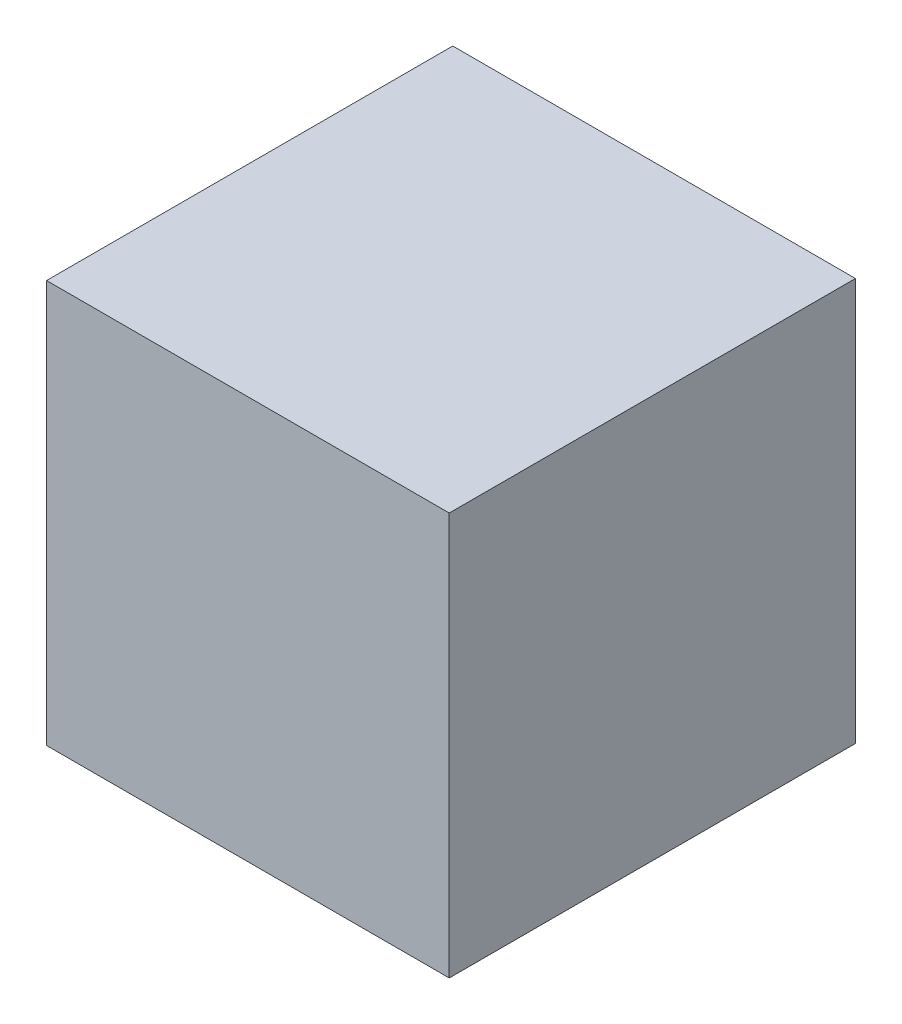
ISO-10303-21;
HEADER;
FILE_DESCRIPTION(('STEP AP214'),'2;1');
FILE_NAME('part.step','',(''),(''),'','','');
FILE_SCHEMA(('AUTOMOTIVE_DESIGN { 1 0 10303 214 1 1 1 1 }'));
ENDSEC;
DATA;
#1=APPLICATION_CONTEXT('core data for automotive mechanical design processes');
#2=APPLICATION_PROTOCOL_DEFINITION('international standard','automotive_design',2000,#1);
#3=PRODUCT_CONTEXT('',#1,'mechanical');
#4=PRODUCT('Part','Part','',(#3));
#5=PRODUCT_RELATED_PRODUCT_CATEGORY('part','',(#4));
#6=PRODUCT_DEFINITION_FORMATION('','',#4);
#7=PRODUCT_DEFINITION_CONTEXT('part definition',#1,'design');
#8=PRODUCT_DEFINITION('design','',#6,#7);
#9=PRODUCT_DEFINITION_SHAPE('','',#8);
#10=(LENGTH_UNIT() NAMED_UNIT(*) SI_UNIT(.MILLI.,.METRE.));
#11=(NAMED_UNIT(*) PLANE_ANGLE_UNIT() SI_UNIT($,.RADIAN.));
#12=(NAMED_UNIT(*) SI_UNIT($,.STERADIAN.) SOLID_ANGLE_UNIT());
#13=UNCERTAINTY_MEASURE_WITH_UNIT(LENGTH_MEASURE(1.E-05),#10,'distance_accuracy_value','');
#14=(GEOMETRIC_REPRESENTATION_CONTEXT(3) GLOBAL_UNCERTAINTY_ASSIGNED_CONTEXT((#13)) GLOBAL_UNIT_ASSIGNED_CONTEXT((#10,
#11,#12)) REPRESENTATION_CONTEXT('',''));
#15=CARTESIAN_POINT('',(0.,0.,0.));
#16=DIRECTION('',(0.,0.,1.));
#17=DIRECTION('',(1.,0.,0.));
#18=AXIS2_PLACEMENT_3D('',#15,#16,#17);
#19=CARTESIAN_POINT('',(0.,0.,20.1745240643728));
#20=DIRECTION('',(1.,0.,0.));
#21=DIRECTION('',(0.,0.,-1.));
#22=AXIS2_PLACEMENT_3D('',#19,#20,#21);
#23=PLANE('',#22);
#24=DIRECTION('',(0.,-1.,0.));
#25=VECTOR('',#24,1.);
#26=CARTESIAN_POINT('',(0.,0.,0.));
#27=LINE('',#26,#25);
#28=CARTESIAN_POINT('',(0.,20.,0.));
#29=VERTEX_POINT('',#28);
#30=CARTESIAN_POINT('',(0.,0.,0.));
#31=VERTEX_POINT('',#30);
#32=EDGE_CURVE('E98',#29,#31,#27,.T.);
#33=ORIENTED_EDGE('',*,*,#32,.T.);
#34=DIRECTION('',(0.,0.,-1.));
#35=VECTOR('',#34,1.);
#36=CARTESIAN_POINT('',(0.,0.,20.1745240643728));
#37=LINE('',#36,#35);
#38=CARTESIAN_POINT('',(0.,0.,20.1745240643728));
#39=VERTEX_POINT('',#38);
#40=EDGE_CURVE('E11',#39,#31,#37,.T.);
#41=ORIENTED_EDGE('',*,*,#40,.F.);
#42=DIRECTION('',(0.,-1.,0.));
#43=VECTOR('',#42,1.);
#44=CARTESIAN_POINT('',(0.,0.,20.1745240643728));
#45=LINE('',#44,#43);
#46=CARTESIAN_POINT('',(0.,20.,20.1745240643728));
#47=VERTEX_POINT('',#46);
#48=EDGE_CURVE('E86',#47,#39,#45,.T.);
#49=ORIENTED_EDGE('',*,*,#48,.F.);
#50=DIRECTION('',(0.,0.,-1.));
#51=VECTOR('',#50,1.);
#52=CARTESIAN_POINT('',(0.,20.,20.1745240643728));
#53=LINE('',#52,#51);
#54=EDGE_CURVE('E94',#47,#29,#53,.T.);
#55=ORIENTED_EDGE('',*,*,#54,.T.);
#56=EDGE_LOOP('',(#33,#41,#49,#55));
#57=FACE_BOUND('',#56,.T.);
#58=ADVANCED_FACE('F35',(#57),#23,.F.);
#59=CARTESIAN_POINT('',(0.,0.,20.1745240643728));
#60=DIRECTION('',(0.,1.,0.));
#61=DIRECTION('',(0.,0.,1.));
#62=AXIS2_PLACEMENT_3D('',#59,#60,#61);
#63=PLANE('',#62);
#64=DIRECTION('',(1.,0.,0.));
#65=VECTOR('',#64,1.);
#66=CARTESIAN_POINT('',(0.,0.,0.));
#67=LINE('',#66,#65);
#68=CARTESIAN_POINT('',(20.,0.,0.));
#69=VERTEX_POINT('',#68);
#70=EDGE_CURVE('E90',#31,#69,#67,.T.);
#71=ORIENTED_EDGE('',*,*,#70,.T.);
#72=DIRECTION('',(0.,0.,-1.));
#73=VECTOR('',#72,1.);
#74=CARTESIAN_POINT('',(20.,0.,20.1745240643728));
#75=LINE('',#74,#73);
#76=CARTESIAN_POINT('',(20.,0.,20.1745240643728));
#77=VERTEX_POINT('',#76);
#78=EDGE_CURVE('E43',#77,#69,#75,.T.);
#79=ORIENTED_EDGE('',*,*,#78,.F.);
#80=DIRECTION('',(1.,0.,0.));
#81=VECTOR('',#80,1.);
#82=CARTESIAN_POINT('',(0.,0.,20.1745240643728));
#83=LINE('',#82,#81);
#84=EDGE_CURVE('E81',#39,#77,#83,.T.);
#85=ORIENTED_EDGE('',*,*,#84,.F.);
#86=ORIENTED_EDGE('',*,*,#40,.T.);
#87=EDGE_LOOP('',(#71,#79,#85,#86));
#88=FACE_BOUND('',#87,.T.);
#89=ADVANCED_FACE('F89',(#88),#63,.F.);
#90=CARTESIAN_POINT('',(20.,0.,20.1745240643728));
#91=DIRECTION('',(-1.,0.,0.));
#92=DIRECTION('',(0.,0.,1.));
#93=AXIS2_PLACEMENT_3D('',#90,#91,#92);
#94=PLANE('',#93);
#95=DIRECTION('',(0.,1.,0.));
#96=VECTOR('',#95,1.);
#97=CARTESIAN_POINT('',(20.,0.,0.));
#98=LINE('',#97,#96);
#99=CARTESIAN_POINT('',(20.,20.,0.));
#100=VERTEX_POINT('',#99);
#101=EDGE_CURVE('E68',#69,#100,#98,.T.);
#102=ORIENTED_EDGE('',*,*,#101,.T.);
#103=DIRECTION('',(0.,0.,-1.));
#104=VECTOR('',#103,1.);
#105=CARTESIAN_POINT('',(20.,20.,20.1745240643728));
#106=LINE('',#105,#104);
#107=CARTESIAN_POINT('',(20.,20.,20.1745240643728));
#108=VERTEX_POINT('',#107);
#109=EDGE_CURVE('E91',#108,#100,#106,.T.);
#110=ORIENTED_EDGE('',*,*,#109,.F.);
#111=DIRECTION('',(0.,1.,0.));
#112=VECTOR('',#111,1.);
#113=CARTESIAN_POINT('',(20.,0.,20.1745240643728));
#114=LINE('',#113,#112);
#115=EDGE_CURVE('E84',#77,#108,#114,.T.);
#116=ORIENTED_EDGE('',*,*,#115,.F.);
#117=ORIENTED_EDGE('',*,*,#78,.T.);
#118=EDGE_LOOP('',(#102,#110,#116,#117));
#119=FACE_BOUND('',#118,.T.);
#120=ADVANCED_FACE('F92',(#119),#94,.F.);
#121=CARTESIAN_POINT('',(0.,20.,20.1745240643728));
#122=DIRECTION('',(0.,-1.,0.));
#123=DIRECTION('',(0.,0.,-1.));
#124=AXIS2_PLACEMENT_3D('',#121,#122,#123);
#125=PLANE('',#124);
#126=DIRECTION('',(-1.,0.,0.));
#127=VECTOR('',#126,1.);
#128=CARTESIAN_POINT('',(0.,20.,0.));
#129=LINE('',#128,#127);
#130=EDGE_CURVE('E74',#100,#29,#129,.T.);
#131=ORIENTED_EDGE('',*,*,#130,.T.);
#132=ORIENTED_EDGE('',*,*,#54,.F.);
#133=DIRECTION('',(-1.,0.,0.));
#134=VECTOR('',#133,1.);
#135=CARTESIAN_POINT('',(0.,20.,20.1745240643728));
#136=LINE('',#135,#134);
#137=EDGE_CURVE('E51',#108,#47,#136,.T.);
#138=ORIENTED_EDGE('',*,*,#137,.F.);
#139=ORIENTED_EDGE('',*,*,#109,.T.);
#140=EDGE_LOOP('',(#131,#132,#138,#139));
#141=FACE_BOUND('',#140,.T.);
#142=ADVANCED_FACE('F105',(#141),#125,.F.);
#143=CARTESIAN_POINT('',(0.,0.,20.1745240643728));
#144=DIRECTION('',(0.,0.,-1.));
#145=DIRECTION('',(-1.,0.,0.));
#146=AXIS2_PLACEMENT_3D('',#143,#144,#145);
#147=PLANE('',#146);
#148=ORIENTED_EDGE('',*,*,#48,.T.);
#149=ORIENTED_EDGE('',*,*,#84,.T.);
#150=ORIENTED_EDGE('',*,*,#115,.T.);
#151=ORIENTED_EDGE('',*,*,#137,.T.);
#152=EDGE_LOOP('',(#148,#149,#150,#151));
#153=FACE_BOUND('',#152,.T.);
#154=ADVANCED_FACE('F82',(#153),#147,.F.);
#155=CARTESIAN_POINT('',(0.,0.,0.));
#156=DIRECTION('',(0.,0.,-1.));
#157=DIRECTION('',(-1.,0.,0.));
#158=AXIS2_PLACEMENT_3D('',#155,#156,#157);
#159=PLANE('',#158);
#160=ORIENTED_EDGE('',*,*,#32,.F.);
#161=ORIENTED_EDGE('',*,*,#130,.F.);
#162=ORIENTED_EDGE('',*,*,#101,.F.);
#163=ORIENTED_EDGE('',*,*,#70,.F.);
#164=EDGE_LOOP('',(#160,#161,#162,#163));
#165=FACE_BOUND('',#164,.T.);
#166=ADVANCED_FACE('F108',(#165),#159,.T.);
#167=CLOSED_SHELL('',(#58,#89,#120,#142,#154,#166));
#168=MANIFOLD_SOLID_BREP('B2',#167);
#169=ADVANCED_BREP_SHAPE_REPRESENTATION('',(#18,#168),#14);
#170=SHAPE_DEFINITION_REPRESENTATION(#9,#169);
ENDSEC;
END-ISO-10303-21;
